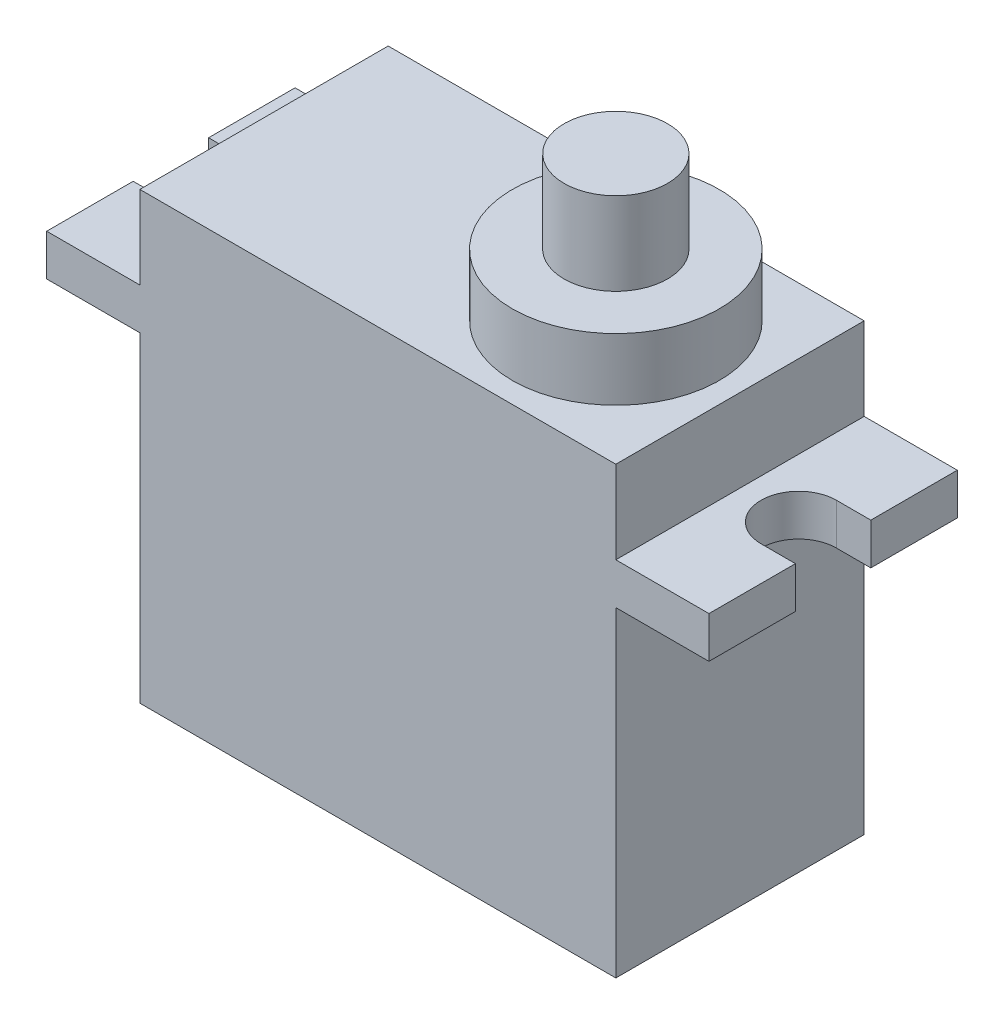
ISO-10303-21;
HEADER;
FILE_DESCRIPTION(('STEP AP214'),'2;1');
FILE_NAME('part.step','',(''),(''),'','','');
FILE_SCHEMA(('AUTOMOTIVE_DESIGN { 1 0 10303 214 1 1 1 1 }'));
ENDSEC;
DATA;
#1=APPLICATION_CONTEXT('core data for automotive mechanical design processes');
#2=APPLICATION_PROTOCOL_DEFINITION('international standard','automotive_design',2000,#1);
#3=PRODUCT_CONTEXT('',#1,'mechanical');
#4=PRODUCT('Part','Part','',(#3));
#5=PRODUCT_RELATED_PRODUCT_CATEGORY('part','',(#4));
#6=PRODUCT_DEFINITION_FORMATION('','',#4);
#7=PRODUCT_DEFINITION_CONTEXT('part definition',#1,'design');
#8=PRODUCT_DEFINITION('design','',#6,#7);
#9=PRODUCT_DEFINITION_SHAPE('','',#8);
#10=(LENGTH_UNIT() NAMED_UNIT(*) SI_UNIT(.MILLI.,.METRE.));
#11=(NAMED_UNIT(*) PLANE_ANGLE_UNIT() SI_UNIT($,.RADIAN.));
#12=(NAMED_UNIT(*) SI_UNIT($,.STERADIAN.) SOLID_ANGLE_UNIT());
#13=UNCERTAINTY_MEASURE_WITH_UNIT(LENGTH_MEASURE(1.E-05),#10,'distance_accuracy_value','');
#14=(GEOMETRIC_REPRESENTATION_CONTEXT(3) GLOBAL_UNCERTAINTY_ASSIGNED_CONTEXT((#13)) GLOBAL_UNIT_ASSIGNED_CONTEXT((#10,
#11,#12)) REPRESENTATION_CONTEXT('',''));
#15=CARTESIAN_POINT('',(0.,0.,0.));
#16=DIRECTION('',(0.,0.,1.));
#17=DIRECTION('',(1.,0.,0.));
#18=AXIS2_PLACEMENT_3D('',#15,#16,#17);
#19=CARTESIAN_POINT('',(-16.,4.75,0.));
#20=DIRECTION('',(-1.,0.,0.));
#21=DIRECTION('',(0.,0.,1.));
#22=AXIS2_PLACEMENT_3D('',#19,#20,#21);
#23=PLANE('',#22);
#24=DIRECTION('',(0.,1.,0.));
#25=VECTOR('',#24,1.);
#26=CARTESIAN_POINT('',(-16.,2.75,4.17873864816859));
#27=LINE('',#26,#25);
#28=CARTESIAN_POINT('',(-16.,4.75,4.17873864816859));
#29=VERTEX_POINT('',#28);
#30=CARTESIAN_POINT('',(-16.,6.75,4.17873864816859));
#31=VERTEX_POINT('',#30);
#32=EDGE_CURVE('E321',#29,#31,#27,.T.);
#33=ORIENTED_EDGE('',*,*,#32,.T.);
#34=DIRECTION('',(0.,0.,1.));
#35=VECTOR('',#34,1.);
#36=CARTESIAN_POINT('',(-16.,6.75,0.));
#37=LINE('',#36,#35);
#38=CARTESIAN_POINT('',(-16.,6.75,0.));
#39=VERTEX_POINT('',#38);
#40=EDGE_CURVE('E237',#39,#31,#37,.T.);
#41=ORIENTED_EDGE('',*,*,#40,.F.);
#42=DIRECTION('',(0.,1.,0.));
#43=VECTOR('',#42,1.);
#44=CARTESIAN_POINT('',(-16.,4.75,0.));
#45=LINE('',#44,#43);
#46=CARTESIAN_POINT('',(-16.,4.75,0.));
#47=VERTEX_POINT('',#46);
#48=EDGE_CURVE('E251',#47,#39,#45,.T.);
#49=ORIENTED_EDGE('',*,*,#48,.F.);
#50=DIRECTION('',(0.,0.,1.));
#51=VECTOR('',#50,1.);
#52=CARTESIAN_POINT('',(-16.,4.75,0.));
#53=LINE('',#52,#51);
#54=EDGE_CURVE('E364',#47,#29,#53,.T.);
#55=ORIENTED_EDGE('',*,*,#54,.T.);
#56=EDGE_LOOP('',(#33,#41,#49,#55));
#57=FACE_BOUND('',#56,.T.);
#58=ADVANCED_FACE('F73',(#57),#23,.T.);
#59=CARTESIAN_POINT('',(16.,4.75,0.));
#60=DIRECTION('',(1.,0.,0.));
#61=DIRECTION('',(0.,0.,-1.));
#62=AXIS2_PLACEMENT_3D('',#59,#60,#61);
#63=PLANE('',#62);
#64=DIRECTION('',(0.,-1.,0.));
#65=VECTOR('',#64,1.);
#66=CARTESIAN_POINT('',(16.,4.75,7.82126135183141));
#67=LINE('',#66,#65);
#68=CARTESIAN_POINT('',(16.,6.75,7.82126135183141));
#69=VERTEX_POINT('',#68);
#70=CARTESIAN_POINT('',(16.,4.75,7.82126135183141));
#71=VERTEX_POINT('',#70);
#72=EDGE_CURVE('E306',#69,#71,#67,.T.);
#73=ORIENTED_EDGE('',*,*,#72,.F.);
#74=DIRECTION('',(0.,0.,-1.));
#75=VECTOR('',#74,1.);
#76=CARTESIAN_POINT('',(16.,6.75,0.));
#77=LINE('',#76,#75);
#78=CARTESIAN_POINT('',(16.,6.75,12.));
#79=VERTEX_POINT('',#78);
#80=EDGE_CURVE('E369',#79,#69,#77,.T.);
#81=ORIENTED_EDGE('',*,*,#80,.F.);
#82=DIRECTION('',(0.,1.,0.));
#83=VECTOR('',#82,1.);
#84=CARTESIAN_POINT('',(16.,4.75,12.));
#85=LINE('',#84,#83);
#86=CARTESIAN_POINT('',(16.,4.75,12.));
#87=VERTEX_POINT('',#86);
#88=EDGE_CURVE('E249',#87,#79,#85,.T.);
#89=ORIENTED_EDGE('',*,*,#88,.F.);
#90=DIRECTION('',(0.,0.,-1.));
#91=VECTOR('',#90,1.);
#92=CARTESIAN_POINT('',(16.,4.75,0.));
#93=LINE('',#92,#91);
#94=EDGE_CURVE('E357',#87,#71,#93,.T.);
#95=ORIENTED_EDGE('',*,*,#94,.T.);
#96=EDGE_LOOP('',(#73,#81,#89,#95));
#97=FACE_BOUND('',#96,.T.);
#98=ADVANCED_FACE('F397',(#97),#63,.T.);
#99=CARTESIAN_POINT('',(11.5,10.75,12.));
#100=DIRECTION('',(-1.,0.,0.));
#101=DIRECTION('',(0.,-1.,0.));
#102=AXIS2_PLACEMENT_3D('',#99,#100,#101);
#103=PLANE('',#102);
#104=DIRECTION('',(0.,0.,-1.));
#105=VECTOR('',#104,1.);
#106=CARTESIAN_POINT('',(11.5,4.75,12.));
#107=LINE('',#106,#105);
#108=CARTESIAN_POINT('',(11.5,4.75,12.));
#109=VERTEX_POINT('',#108);
#110=CARTESIAN_POINT('',(11.5,4.75,0.));
#111=VERTEX_POINT('',#110);
#112=EDGE_CURVE('E270',#109,#111,#107,.T.);
#113=ORIENTED_EDGE('',*,*,#112,.F.);
#114=DIRECTION('',(0.,1.,0.));
#115=VECTOR('',#114,1.);
#116=CARTESIAN_POINT('',(11.5,10.75,12.));
#117=LINE('',#116,#115);
#118=CARTESIAN_POINT('',(11.5,-10.75,12.));
#119=VERTEX_POINT('',#118);
#120=EDGE_CURVE('E269',#119,#109,#117,.T.);
#121=ORIENTED_EDGE('',*,*,#120,.F.);
#122=DIRECTION('',(0.,0.,-1.));
#123=VECTOR('',#122,1.);
#124=CARTESIAN_POINT('',(11.5,-10.75,12.));
#125=LINE('',#124,#123);
#126=CARTESIAN_POINT('',(11.5,-10.75,0.));
#127=VERTEX_POINT('',#126);
#128=EDGE_CURVE('E285',#119,#127,#125,.T.);
#129=ORIENTED_EDGE('',*,*,#128,.T.);
#130=DIRECTION('',(0.,1.,0.));
#131=VECTOR('',#130,1.);
#132=CARTESIAN_POINT('',(11.5,10.75,0.));
#133=LINE('',#132,#131);
#134=EDGE_CURVE('E282',#127,#111,#133,.T.);
#135=ORIENTED_EDGE('',*,*,#134,.T.);
#136=EDGE_LOOP('',(#113,#121,#129,#135));
#137=FACE_BOUND('',#136,.T.);
#138=ADVANCED_FACE('F414',(#137),#103,.F.);
#139=CARTESIAN_POINT('',(-11.5,10.75,12.));
#140=DIRECTION('',(1.,0.,0.));
#141=DIRECTION('',(0.,1.,0.));
#142=AXIS2_PLACEMENT_3D('',#139,#140,#141);
#143=PLANE('',#142);
#144=DIRECTION('',(0.,0.,1.));
#145=VECTOR('',#144,1.);
#146=CARTESIAN_POINT('',(-11.5,4.75,12.));
#147=LINE('',#146,#145);
#148=CARTESIAN_POINT('',(-11.5,4.75,0.));
#149=VERTEX_POINT('',#148);
#150=CARTESIAN_POINT('',(-11.5,4.75,12.));
#151=VERTEX_POINT('',#150);
#152=EDGE_CURVE('E264',#149,#151,#147,.T.);
#153=ORIENTED_EDGE('',*,*,#152,.F.);
#154=DIRECTION('',(0.,-1.,0.));
#155=VECTOR('',#154,1.);
#156=CARTESIAN_POINT('',(-11.5,10.75,0.));
#157=LINE('',#156,#155);
#158=CARTESIAN_POINT('',(-11.5,-10.75,0.));
#159=VERTEX_POINT('',#158);
#160=EDGE_CURVE('E286',#149,#159,#157,.T.);
#161=ORIENTED_EDGE('',*,*,#160,.T.);
#162=DIRECTION('',(0.,0.,-1.));
#163=VECTOR('',#162,1.);
#164=CARTESIAN_POINT('',(-11.5,-10.75,12.));
#165=LINE('',#164,#163);
#166=CARTESIAN_POINT('',(-11.5,-10.75,12.));
#167=VERTEX_POINT('',#166);
#168=EDGE_CURVE('E296',#167,#159,#165,.T.);
#169=ORIENTED_EDGE('',*,*,#168,.F.);
#170=DIRECTION('',(0.,-1.,0.));
#171=VECTOR('',#170,1.);
#172=CARTESIAN_POINT('',(-11.5,10.75,12.));
#173=LINE('',#172,#171);
#174=EDGE_CURVE('E277',#151,#167,#173,.T.);
#175=ORIENTED_EDGE('',*,*,#174,.F.);
#176=EDGE_LOOP('',(#153,#161,#169,#175));
#177=FACE_BOUND('',#176,.T.);
#178=ADVANCED_FACE('F424',(#177),#143,.F.);
#179=CARTESIAN_POINT('',(11.5,6.75,12.));
#180=VERTEX_POINT('',#179);
#181=CARTESIAN_POINT('',(11.5,10.75,12.));
#182=VERTEX_POINT('',#181);
#183=EDGE_CURVE('E273',#180,#182,#117,.T.);
#184=ORIENTED_EDGE('',*,*,#183,.F.);
#185=DIRECTION('',(0.,0.,-1.));
#186=VECTOR('',#185,1.);
#187=CARTESIAN_POINT('',(11.5,6.75,12.));
#188=LINE('',#187,#186);
#189=CARTESIAN_POINT('',(11.5,6.75,0.));
#190=VERTEX_POINT('',#189);
#191=EDGE_CURVE('E265',#180,#190,#188,.T.);
#192=ORIENTED_EDGE('',*,*,#191,.T.);
#193=CARTESIAN_POINT('',(11.5,10.75,0.));
#194=VERTEX_POINT('',#193);
#195=EDGE_CURVE('E267',#190,#194,#133,.T.);
#196=ORIENTED_EDGE('',*,*,#195,.T.);
#197=DIRECTION('',(0.,0.,-1.));
#198=VECTOR('',#197,1.);
#199=CARTESIAN_POINT('',(11.5,10.75,12.));
#200=LINE('',#199,#198);
#201=EDGE_CURVE('E302',#182,#194,#200,.T.);
#202=ORIENTED_EDGE('',*,*,#201,.F.);
#203=EDGE_LOOP('',(#184,#192,#196,#202));
#204=FACE_BOUND('',#203,.T.);
#205=ADVANCED_FACE('F80',(#204),#103,.F.);
#206=CARTESIAN_POINT('',(-11.5,10.75,12.));
#207=DIRECTION('',(0.,-1.,0.));
#208=DIRECTION('',(0.,0.,-1.));
#209=AXIS2_PLACEMENT_3D('',#206,#207,#208);
#210=PLANE('',#209);
#211=CARTESIAN_POINT('',(5.5,10.75,6.));
#212=DIRECTION('',(0.,1.,0.));
#213=DIRECTION('',(0.,0.,1.));
#214=AXIS2_PLACEMENT_3D('',#211,#212,#213);
#215=CIRCLE('',#214,5.);
#216=CARTESIAN_POINT('',(5.5,10.75,11.));
#217=VERTEX_POINT('',#216);
#218=EDGE_CURVE('E305',#217,#217,#215,.T.);
#219=ORIENTED_EDGE('',*,*,#218,.F.);
#220=EDGE_LOOP('',(#219));
#221=FACE_BOUND('',#220,.T.);
#222=DIRECTION('',(-1.,0.,0.));
#223=VECTOR('',#222,1.);
#224=CARTESIAN_POINT('',(-11.5,10.75,0.));
#225=LINE('',#224,#223);
#226=CARTESIAN_POINT('',(-11.5,10.75,0.));
#227=VERTEX_POINT('',#226);
#228=EDGE_CURVE('E288',#194,#227,#225,.T.);
#229=ORIENTED_EDGE('',*,*,#228,.T.);
#230=DIRECTION('',(0.,0.,-1.));
#231=VECTOR('',#230,1.);
#232=CARTESIAN_POINT('',(-11.5,10.75,12.));
#233=LINE('',#232,#231);
#234=CARTESIAN_POINT('',(-11.5,10.75,12.));
#235=VERTEX_POINT('',#234);
#236=EDGE_CURVE('E298',#235,#227,#233,.T.);
#237=ORIENTED_EDGE('',*,*,#236,.F.);
#238=DIRECTION('',(-1.,0.,0.));
#239=VECTOR('',#238,1.);
#240=CARTESIAN_POINT('',(-11.5,10.75,12.));
#241=LINE('',#240,#239);
#242=EDGE_CURVE('E272',#182,#235,#241,.T.);
#243=ORIENTED_EDGE('',*,*,#242,.F.);
#244=ORIENTED_EDGE('',*,*,#201,.T.);
#245=EDGE_LOOP('',(#229,#237,#243,#244));
#246=FACE_BOUND('',#245,.T.);
#247=ADVANCED_FACE('F469',(#221,#246),#210,.F.);
#248=CARTESIAN_POINT('',(-11.5,6.75,0.));
#249=VERTEX_POINT('',#248);
#250=EDGE_CURVE('E289',#227,#249,#157,.T.);
#251=ORIENTED_EDGE('',*,*,#250,.T.);
#252=DIRECTION('',(0.,0.,1.));
#253=VECTOR('',#252,1.);
#254=CARTESIAN_POINT('',(-11.5,6.75,12.));
#255=LINE('',#254,#253);
#256=CARTESIAN_POINT('',(-11.5,6.75,12.));
#257=VERTEX_POINT('',#256);
#258=EDGE_CURVE('E253',#249,#257,#255,.T.);
#259=ORIENTED_EDGE('',*,*,#258,.T.);
#260=EDGE_CURVE('E280',#235,#257,#173,.T.);
#261=ORIENTED_EDGE('',*,*,#260,.F.);
#262=ORIENTED_EDGE('',*,*,#236,.T.);
#263=EDGE_LOOP('',(#251,#259,#261,#262));
#264=FACE_BOUND('',#263,.T.);
#265=ADVANCED_FACE('F429',(#264),#143,.F.);
#266=CARTESIAN_POINT('',(-11.5,-10.75,12.));
#267=DIRECTION('',(0.,1.,0.));
#268=DIRECTION('',(0.,0.,1.));
#269=AXIS2_PLACEMENT_3D('',#266,#267,#268);
#270=PLANE('',#269);
#271=DIRECTION('',(1.,0.,0.));
#272=VECTOR('',#271,1.);
#273=CARTESIAN_POINT('',(-11.5,-10.75,0.));
#274=LINE('',#273,#272);
#275=EDGE_CURVE('E295',#159,#127,#274,.T.);
#276=ORIENTED_EDGE('',*,*,#275,.T.);
#277=ORIENTED_EDGE('',*,*,#128,.F.);
#278=DIRECTION('',(1.,0.,0.));
#279=VECTOR('',#278,1.);
#280=CARTESIAN_POINT('',(-11.5,-10.75,12.));
#281=LINE('',#280,#279);
#282=EDGE_CURVE('E278',#167,#119,#281,.T.);
#283=ORIENTED_EDGE('',*,*,#282,.F.);
#284=ORIENTED_EDGE('',*,*,#168,.T.);
#285=EDGE_LOOP('',(#276,#277,#283,#284));
#286=FACE_BOUND('',#285,.T.);
#287=ADVANCED_FACE('F416',(#286),#270,.F.);
#288=CARTESIAN_POINT('',(0.,0.,12.));
#289=DIRECTION('',(0.,0.,1.));
#290=DIRECTION('',(1.,0.,0.));
#291=AXIS2_PLACEMENT_3D('',#288,#289,#290);
#292=PLANE('',#291);
#293=ORIENTED_EDGE('',*,*,#260,.T.);
#294=DIRECTION('',(1.,0.,0.));
#295=VECTOR('',#294,1.);
#296=CARTESIAN_POINT('',(-16.,6.75,12.));
#297=LINE('',#296,#295);
#298=CARTESIAN_POINT('',(-16.,6.75,12.));
#299=VERTEX_POINT('',#298);
#300=EDGE_CURVE('E244',#299,#257,#297,.T.);
#301=ORIENTED_EDGE('',*,*,#300,.F.);
#302=DIRECTION('',(0.,1.,0.));
#303=VECTOR('',#302,1.);
#304=CARTESIAN_POINT('',(-16.,4.75,12.));
#305=LINE('',#304,#303);
#306=CARTESIAN_POINT('',(-16.,4.75,12.));
#307=VERTEX_POINT('',#306);
#308=EDGE_CURVE('E234',#307,#299,#305,.T.);
#309=ORIENTED_EDGE('',*,*,#308,.F.);
#310=DIRECTION('',(1.,0.,0.));
#311=VECTOR('',#310,1.);
#312=CARTESIAN_POINT('',(-16.,4.75,12.));
#313=LINE('',#312,#311);
#314=EDGE_CURVE('E259',#307,#151,#313,.T.);
#315=ORIENTED_EDGE('',*,*,#314,.T.);
#316=ORIENTED_EDGE('',*,*,#174,.T.);
#317=ORIENTED_EDGE('',*,*,#282,.T.);
#318=ORIENTED_EDGE('',*,*,#120,.T.);
#319=EDGE_CURVE('E370',#109,#87,#313,.T.);
#320=ORIENTED_EDGE('',*,*,#319,.T.);
#321=ORIENTED_EDGE('',*,*,#88,.T.);
#322=EDGE_CURVE('E238',#180,#79,#297,.T.);
#323=ORIENTED_EDGE('',*,*,#322,.F.);
#324=ORIENTED_EDGE('',*,*,#183,.T.);
#325=ORIENTED_EDGE('',*,*,#242,.T.);
#326=EDGE_LOOP('',(#293,#301,#309,#315,#316,#317,#318,#320,#321,#323,#324,#325));
#327=FACE_BOUND('',#326,.T.);
#328=ADVANCED_FACE('F393',(#327),#292,.T.);
#329=CARTESIAN_POINT('',(0.,0.,0.));
#330=DIRECTION('',(0.,0.,1.));
#331=DIRECTION('',(1.,0.,0.));
#332=AXIS2_PLACEMENT_3D('',#329,#330,#331);
#333=PLANE('',#332);
#334=ORIENTED_EDGE('',*,*,#195,.F.);
#335=DIRECTION('',(-1.,0.,0.));
#336=VECTOR('',#335,1.);
#337=CARTESIAN_POINT('',(-16.,6.75,0.));
#338=LINE('',#337,#336);
#339=CARTESIAN_POINT('',(16.,6.75,0.));
#340=VERTEX_POINT('',#339);
#341=EDGE_CURVE('E240',#340,#190,#338,.T.);
#342=ORIENTED_EDGE('',*,*,#341,.F.);
#343=DIRECTION('',(0.,1.,0.));
#344=VECTOR('',#343,1.);
#345=CARTESIAN_POINT('',(16.,4.75,0.));
#346=LINE('',#345,#344);
#347=CARTESIAN_POINT('',(16.,4.75,0.));
#348=VERTEX_POINT('',#347);
#349=EDGE_CURVE('E258',#348,#340,#346,.T.);
#350=ORIENTED_EDGE('',*,*,#349,.F.);
#351=DIRECTION('',(-1.,0.,0.));
#352=VECTOR('',#351,1.);
#353=CARTESIAN_POINT('',(-16.,4.75,0.));
#354=LINE('',#353,#352);
#355=EDGE_CURVE('E363',#348,#111,#354,.T.);
#356=ORIENTED_EDGE('',*,*,#355,.T.);
#357=ORIENTED_EDGE('',*,*,#134,.F.);
#358=ORIENTED_EDGE('',*,*,#275,.F.);
#359=ORIENTED_EDGE('',*,*,#160,.F.);
#360=EDGE_CURVE('E360',#149,#47,#354,.T.);
#361=ORIENTED_EDGE('',*,*,#360,.T.);
#362=ORIENTED_EDGE('',*,*,#48,.T.);
#363=EDGE_CURVE('E241',#249,#39,#338,.T.);
#364=ORIENTED_EDGE('',*,*,#363,.F.);
#365=ORIENTED_EDGE('',*,*,#250,.F.);
#366=ORIENTED_EDGE('',*,*,#228,.F.);
#367=EDGE_LOOP('',(#334,#342,#350,#356,#357,#358,#359,#361,#362,#364,#365,#366));
#368=FACE_BOUND('',#367,.T.);
#369=ADVANCED_FACE('F387',(#368),#333,.F.);
#370=DIRECTION('',(0.,1.,0.));
#371=VECTOR('',#370,1.);
#372=CARTESIAN_POINT('',(-16.,2.75,7.82126135183141));
#373=LINE('',#372,#371);
#374=CARTESIAN_POINT('',(-16.,4.75,7.82126135183141));
#375=VERTEX_POINT('',#374);
#376=CARTESIAN_POINT('',(-16.,6.75,7.82126135183141));
#377=VERTEX_POINT('',#376);
#378=EDGE_CURVE('E211',#375,#377,#373,.T.);
#379=ORIENTED_EDGE('',*,*,#378,.F.);
#380=EDGE_CURVE('E365',#375,#307,#53,.T.);
#381=ORIENTED_EDGE('',*,*,#380,.T.);
#382=ORIENTED_EDGE('',*,*,#308,.T.);
#383=EDGE_CURVE('E226',#377,#299,#37,.T.);
#384=ORIENTED_EDGE('',*,*,#383,.F.);
#385=EDGE_LOOP('',(#379,#381,#382,#384));
#386=FACE_BOUND('',#385,.T.);
#387=ADVANCED_FACE('F235',(#386),#23,.T.);
#388=CARTESIAN_POINT('',(0.,6.75,0.));
#389=DIRECTION('',(0.,1.,0.));
#390=DIRECTION('',(0.,0.,1.));
#391=AXIS2_PLACEMENT_3D('',#388,#389,#390);
#392=PLANE('',#391);
#393=DIRECTION('',(-1.,0.,0.));
#394=VECTOR('',#393,1.);
#395=CARTESIAN_POINT('',(-16.,6.75,4.17873864816859));
#396=LINE('',#395,#394);
#397=CARTESIAN_POINT('',(-14.3375893654815,6.75,4.17873864816859));
#398=VERTEX_POINT('',#397);
#399=EDGE_CURVE('E222',#398,#31,#396,.T.);
#400=ORIENTED_EDGE('',*,*,#399,.F.);
#401=CARTESIAN_POINT('',(-14.3375893654815,6.75,6.));
#402=DIRECTION('',(0.,1.,0.));
#403=DIRECTION('',(0.,0.,1.));
#404=AXIS2_PLACEMENT_3D('',#401,#402,#403);
#405=CIRCLE('',#404,1.82126135183141);
#406=CARTESIAN_POINT('',(-14.3375893654815,6.75,7.82126135183141));
#407=VERTEX_POINT('',#406);
#408=EDGE_CURVE('E228',#407,#398,#405,.T.);
#409=ORIENTED_EDGE('',*,*,#408,.F.);
#410=DIRECTION('',(1.,0.,0.));
#411=VECTOR('',#410,1.);
#412=CARTESIAN_POINT('',(-16.,6.75,7.82126135183141));
#413=LINE('',#412,#411);
#414=EDGE_CURVE('E212',#377,#407,#413,.T.);
#415=ORIENTED_EDGE('',*,*,#414,.F.);
#416=ORIENTED_EDGE('',*,*,#383,.T.);
#417=ORIENTED_EDGE('',*,*,#300,.T.);
#418=ORIENTED_EDGE('',*,*,#258,.F.);
#419=ORIENTED_EDGE('',*,*,#363,.T.);
#420=ORIENTED_EDGE('',*,*,#40,.T.);
#421=EDGE_LOOP('',(#400,#409,#415,#416,#417,#418,#419,#420));
#422=FACE_BOUND('',#421,.T.);
#423=ADVANCED_FACE('F223',(#422),#392,.T.);
#424=CARTESIAN_POINT('',(0.,4.75,0.));
#425=DIRECTION('',(0.,1.,0.));
#426=DIRECTION('',(0.,0.,1.));
#427=AXIS2_PLACEMENT_3D('',#424,#425,#426);
#428=PLANE('',#427);
#429=CARTESIAN_POINT('',(-14.3375893654815,4.75,6.));
#430=DIRECTION('',(0.,1.,0.));
#431=DIRECTION('',(0.,0.,1.));
#432=AXIS2_PLACEMENT_3D('',#429,#430,#431);
#433=CIRCLE('',#432,1.82126135183141);
#434=CARTESIAN_POINT('',(-14.3375893654815,4.75,7.82126135183141));
#435=VERTEX_POINT('',#434);
#436=CARTESIAN_POINT('',(-14.3375893654815,4.75,4.17873864816859));
#437=VERTEX_POINT('',#436);
#438=EDGE_CURVE('E84',#435,#437,#433,.T.);
#439=ORIENTED_EDGE('',*,*,#438,.T.);
#440=DIRECTION('',(-1.,0.,0.));
#441=VECTOR('',#440,1.);
#442=CARTESIAN_POINT('',(0.,4.75,4.17873864816859));
#443=LINE('',#442,#441);
#444=EDGE_CURVE('E12',#437,#29,#443,.T.);
#445=ORIENTED_EDGE('',*,*,#444,.T.);
#446=ORIENTED_EDGE('',*,*,#54,.F.);
#447=ORIENTED_EDGE('',*,*,#360,.F.);
#448=ORIENTED_EDGE('',*,*,#152,.T.);
#449=ORIENTED_EDGE('',*,*,#314,.F.);
#450=ORIENTED_EDGE('',*,*,#380,.F.);
#451=DIRECTION('',(1.,0.,0.));
#452=VECTOR('',#451,1.);
#453=CARTESIAN_POINT('',(0.,4.75,7.82126135183141));
#454=LINE('',#453,#452);
#455=EDGE_CURVE('E220',#375,#435,#454,.T.);
#456=ORIENTED_EDGE('',*,*,#455,.T.);
#457=EDGE_LOOP('',(#439,#445,#446,#447,#448,#449,#450,#456));
#458=FACE_BOUND('',#457,.T.);
#459=ADVANCED_FACE('F311',(#458),#428,.F.);
#460=CARTESIAN_POINT('',(14.3375893654815,4.75,6.));
#461=DIRECTION('',(0.,1.,0.));
#462=DIRECTION('',(0.,0.,1.));
#463=AXIS2_PLACEMENT_3D('',#460,#461,#462);
#464=CIRCLE('',#463,1.82126135183141);
#465=CARTESIAN_POINT('',(14.3375893654815,4.75,4.17873864816859));
#466=VERTEX_POINT('',#465);
#467=CARTESIAN_POINT('',(14.3375893654815,4.75,7.82126135183141));
#468=VERTEX_POINT('',#467);
#469=EDGE_CURVE('E341',#466,#468,#464,.T.);
#470=ORIENTED_EDGE('',*,*,#469,.T.);
#471=DIRECTION('',(1.,0.,0.));
#472=VECTOR('',#471,1.);
#473=CARTESIAN_POINT('',(0.,4.75,7.82126135183141));
#474=LINE('',#473,#472);
#475=EDGE_CURVE('E339',#468,#71,#474,.T.);
#476=ORIENTED_EDGE('',*,*,#475,.T.);
#477=ORIENTED_EDGE('',*,*,#94,.F.);
#478=ORIENTED_EDGE('',*,*,#319,.F.);
#479=ORIENTED_EDGE('',*,*,#112,.T.);
#480=ORIENTED_EDGE('',*,*,#355,.F.);
#481=CARTESIAN_POINT('',(16.,4.75,4.17873864816859));
#482=VERTEX_POINT('',#481);
#483=EDGE_CURVE('E247',#482,#348,#93,.T.);
#484=ORIENTED_EDGE('',*,*,#483,.F.);
#485=DIRECTION('',(-1.,0.,0.));
#486=VECTOR('',#485,1.);
#487=CARTESIAN_POINT('',(0.,4.75,4.17873864816859));
#488=LINE('',#487,#486);
#489=EDGE_CURVE('E98',#482,#466,#488,.T.);
#490=ORIENTED_EDGE('',*,*,#489,.T.);
#491=EDGE_LOOP('',(#470,#476,#477,#478,#479,#480,#484,#490));
#492=FACE_BOUND('',#491,.T.);
#493=ADVANCED_FACE('F403',(#492),#428,.F.);
#494=DIRECTION('',(1.,0.,0.));
#495=VECTOR('',#494,1.);
#496=CARTESIAN_POINT('',(16.,6.75,7.82126135183141));
#497=LINE('',#496,#495);
#498=CARTESIAN_POINT('',(14.3375893654815,6.75,7.82126135183141));
#499=VERTEX_POINT('',#498);
#500=EDGE_CURVE('E329',#499,#69,#497,.T.);
#501=ORIENTED_EDGE('',*,*,#500,.F.);
#502=CARTESIAN_POINT('',(14.3375893654815,6.75,6.));
#503=DIRECTION('',(0.,1.,0.));
#504=DIRECTION('',(0.,0.,-1.));
#505=AXIS2_PLACEMENT_3D('',#502,#503,#504);
#506=CIRCLE('',#505,1.82126135183141);
#507=CARTESIAN_POINT('',(14.3375893654815,6.75,4.17873864816859));
#508=VERTEX_POINT('',#507);
#509=EDGE_CURVE('E331',#508,#499,#506,.T.);
#510=ORIENTED_EDGE('',*,*,#509,.F.);
#511=DIRECTION('',(-1.,0.,0.));
#512=VECTOR('',#511,1.);
#513=CARTESIAN_POINT('',(16.,6.75,4.17873864816859));
#514=LINE('',#513,#512);
#515=CARTESIAN_POINT('',(16.,6.75,4.17873864816859));
#516=VERTEX_POINT('',#515);
#517=EDGE_CURVE('E229',#516,#508,#514,.T.);
#518=ORIENTED_EDGE('',*,*,#517,.F.);
#519=EDGE_CURVE('E353',#516,#340,#77,.T.);
#520=ORIENTED_EDGE('',*,*,#519,.T.);
#521=ORIENTED_EDGE('',*,*,#341,.T.);
#522=ORIENTED_EDGE('',*,*,#191,.F.);
#523=ORIENTED_EDGE('',*,*,#322,.T.);
#524=ORIENTED_EDGE('',*,*,#80,.T.);
#525=EDGE_LOOP('',(#501,#510,#518,#520,#521,#522,#523,#524));
#526=FACE_BOUND('',#525,.T.);
#527=ADVANCED_FACE('F376',(#526),#392,.T.);
#528=DIRECTION('',(0.,1.,0.));
#529=VECTOR('',#528,1.);
#530=CARTESIAN_POINT('',(16.,4.75,4.17873864816859));
#531=LINE('',#530,#529);
#532=EDGE_CURVE('E308',#482,#516,#531,.T.);
#533=ORIENTED_EDGE('',*,*,#532,.F.);
#534=ORIENTED_EDGE('',*,*,#483,.T.);
#535=ORIENTED_EDGE('',*,*,#349,.T.);
#536=ORIENTED_EDGE('',*,*,#519,.F.);
#537=EDGE_LOOP('',(#533,#534,#535,#536));
#538=FACE_BOUND('',#537,.T.);
#539=ADVANCED_FACE('F381',(#538),#63,.T.);
#540=CARTESIAN_POINT('',(5.5,13.75,6.));
#541=DIRECTION('',(0.,-1.,0.));
#542=DIRECTION('',(0.,0.,-1.));
#543=AXIS2_PLACEMENT_3D('',#540,#541,#542);
#544=CYLINDRICAL_SURFACE('',#543,5.);
#545=CARTESIAN_POINT('',(5.5,13.75,6.));
#546=DIRECTION('',(0.,1.,0.));
#547=DIRECTION('',(0.,0.,1.));
#548=AXIS2_PLACEMENT_3D('',#545,#546,#547);
#549=CIRCLE('',#548,5.);
#550=CARTESIAN_POINT('',(5.5,13.75,11.));
#551=VERTEX_POINT('',#550);
#552=EDGE_CURVE('E349',#551,#551,#549,.T.);
#553=ORIENTED_EDGE('',*,*,#552,.F.);
#554=EDGE_LOOP('',(#553));
#555=FACE_BOUND('',#554,.T.);
#556=ORIENTED_EDGE('',*,*,#218,.T.);
#557=EDGE_LOOP('',(#556));
#558=FACE_BOUND('',#557,.T.);
#559=ADVANCED_FACE('F480',(#555,#558),#544,.T.);
#560=CARTESIAN_POINT('',(5.5,13.75,6.));
#561=DIRECTION('',(0.,1.,0.));
#562=DIRECTION('',(0.,0.,1.));
#563=AXIS2_PLACEMENT_3D('',#560,#561,#562);
#564=PLANE('',#563);
#565=CARTESIAN_POINT('',(5.5,13.75,6.));
#566=DIRECTION('',(0.,1.,0.));
#567=DIRECTION('',(0.,0.,1.));
#568=AXIS2_PLACEMENT_3D('',#565,#566,#567);
#569=CIRCLE('',#568,2.5);
#570=CARTESIAN_POINT('',(5.5,13.75,8.5));
#571=VERTEX_POINT('',#570);
#572=EDGE_CURVE('E310',#571,#571,#569,.T.);
#573=ORIENTED_EDGE('',*,*,#572,.F.);
#574=EDGE_LOOP('',(#573));
#575=FACE_BOUND('',#574,.T.);
#576=ORIENTED_EDGE('',*,*,#552,.T.);
#577=EDGE_LOOP('',(#576));
#578=FACE_BOUND('',#577,.T.);
#579=ADVANCED_FACE('F476',(#575,#578),#564,.T.);
#580=CARTESIAN_POINT('',(5.5,17.75,6.));
#581=DIRECTION('',(0.,-1.,0.));
#582=DIRECTION('',(0.,0.,-1.));
#583=AXIS2_PLACEMENT_3D('',#580,#581,#582);
#584=CYLINDRICAL_SURFACE('',#583,2.5);
#585=CARTESIAN_POINT('',(5.5,17.75,6.));
#586=DIRECTION('',(0.,1.,0.));
#587=DIRECTION('',(0.,0.,1.));
#588=AXIS2_PLACEMENT_3D('',#585,#586,#587);
#589=CIRCLE('',#588,2.5);
#590=CARTESIAN_POINT('',(5.5,17.75,8.5));
#591=VERTEX_POINT('',#590);
#592=EDGE_CURVE('E347',#591,#591,#589,.T.);
#593=ORIENTED_EDGE('',*,*,#592,.F.);
#594=EDGE_LOOP('',(#593));
#595=FACE_BOUND('',#594,.T.);
#596=ORIENTED_EDGE('',*,*,#572,.T.);
#597=EDGE_LOOP('',(#596));
#598=FACE_BOUND('',#597,.T.);
#599=ADVANCED_FACE('F482',(#595,#598),#584,.T.);
#600=CARTESIAN_POINT('',(5.5,17.75,6.));
#601=DIRECTION('',(0.,1.,0.));
#602=DIRECTION('',(0.,0.,1.));
#603=AXIS2_PLACEMENT_3D('',#600,#601,#602);
#604=PLANE('',#603);
#605=ORIENTED_EDGE('',*,*,#592,.T.);
#606=EDGE_LOOP('',(#605));
#607=FACE_BOUND('',#606,.T.);
#608=ADVANCED_FACE('F507',(#607),#604,.T.);
#609=CARTESIAN_POINT('',(14.3375893654815,2.75,6.));
#610=DIRECTION('',(0.,1.,0.));
#611=DIRECTION('',(0.,0.,1.));
#612=AXIS2_PLACEMENT_3D('',#609,#610,#611);
#613=CYLINDRICAL_SURFACE('',#612,1.82126135183141);
#614=DIRECTION('',(0.,1.,0.));
#615=VECTOR('',#614,1.);
#616=CARTESIAN_POINT('',(14.3375893654815,2.75,4.17873864816859));
#617=LINE('',#616,#615);
#618=EDGE_CURVE('E327',#466,#508,#617,.T.);
#619=ORIENTED_EDGE('',*,*,#618,.T.);
#620=ORIENTED_EDGE('',*,*,#509,.T.);
#621=DIRECTION('',(0.,1.,0.));
#622=VECTOR('',#621,1.);
#623=CARTESIAN_POINT('',(14.3375893654815,2.75,7.82126135183141));
#624=LINE('',#623,#622);
#625=EDGE_CURVE('E332',#468,#499,#624,.T.);
#626=ORIENTED_EDGE('',*,*,#625,.F.);
#627=ORIENTED_EDGE('',*,*,#469,.F.);
#628=EDGE_LOOP('',(#619,#620,#626,#627));
#629=FACE_BOUND('',#628,.T.);
#630=ADVANCED_FACE('F410',(#629),#613,.F.);
#631=CARTESIAN_POINT('',(16.,2.75,7.82126135183141));
#632=DIRECTION('',(0.,0.,1.));
#633=DIRECTION('',(1.,0.,0.));
#634=AXIS2_PLACEMENT_3D('',#631,#632,#633);
#635=PLANE('',#634);
#636=ORIENTED_EDGE('',*,*,#625,.T.);
#637=ORIENTED_EDGE('',*,*,#500,.T.);
#638=ORIENTED_EDGE('',*,*,#72,.T.);
#639=ORIENTED_EDGE('',*,*,#475,.F.);
#640=EDGE_LOOP('',(#636,#637,#638,#639));
#641=FACE_BOUND('',#640,.T.);
#642=ADVANCED_FACE('F405',(#641),#635,.F.);
#643=CARTESIAN_POINT('',(16.,2.75,4.17873864816859));
#644=DIRECTION('',(0.,0.,-1.));
#645=DIRECTION('',(-1.,0.,0.));
#646=AXIS2_PLACEMENT_3D('',#643,#644,#645);
#647=PLANE('',#646);
#648=ORIENTED_EDGE('',*,*,#532,.T.);
#649=ORIENTED_EDGE('',*,*,#517,.T.);
#650=ORIENTED_EDGE('',*,*,#618,.F.);
#651=ORIENTED_EDGE('',*,*,#489,.F.);
#652=EDGE_LOOP('',(#648,#649,#650,#651));
#653=FACE_BOUND('',#652,.T.);
#654=ADVANCED_FACE('F407',(#653),#647,.F.);
#655=CARTESIAN_POINT('',(-16.,2.75,4.17873864816859));
#656=DIRECTION('',(0.,0.,-1.));
#657=DIRECTION('',(-1.,0.,0.));
#658=AXIS2_PLACEMENT_3D('',#655,#656,#657);
#659=PLANE('',#658);
#660=DIRECTION('',(0.,1.,0.));
#661=VECTOR('',#660,1.);
#662=CARTESIAN_POINT('',(-14.3375893654815,2.75,4.17873864816859));
#663=LINE('',#662,#661);
#664=EDGE_CURVE('E317',#437,#398,#663,.T.);
#665=ORIENTED_EDGE('',*,*,#664,.T.);
#666=ORIENTED_EDGE('',*,*,#399,.T.);
#667=ORIENTED_EDGE('',*,*,#32,.F.);
#668=ORIENTED_EDGE('',*,*,#444,.F.);
#669=EDGE_LOOP('',(#665,#666,#667,#668));
#670=FACE_BOUND('',#669,.T.);
#671=ADVANCED_FACE('F432',(#670),#659,.F.);
#672=CARTESIAN_POINT('',(-14.3375893654815,2.75,6.));
#673=DIRECTION('',(0.,1.,0.));
#674=DIRECTION('',(0.,0.,1.));
#675=AXIS2_PLACEMENT_3D('',#672,#673,#674);
#676=CYLINDRICAL_SURFACE('',#675,1.82126135183141);
#677=DIRECTION('',(0.,1.,0.));
#678=VECTOR('',#677,1.);
#679=CARTESIAN_POINT('',(-14.3375893654815,2.75,7.82126135183141));
#680=LINE('',#679,#678);
#681=EDGE_CURVE('E89',#435,#407,#680,.T.);
#682=ORIENTED_EDGE('',*,*,#681,.T.);
#683=ORIENTED_EDGE('',*,*,#408,.T.);
#684=ORIENTED_EDGE('',*,*,#664,.F.);
#685=ORIENTED_EDGE('',*,*,#438,.F.);
#686=EDGE_LOOP('',(#682,#683,#684,#685));
#687=FACE_BOUND('',#686,.T.);
#688=ADVANCED_FACE('F318',(#687),#676,.F.);
#689=CARTESIAN_POINT('',(-16.,2.75,7.82126135183141));
#690=DIRECTION('',(0.,0.,1.));
#691=DIRECTION('',(1.,0.,0.));
#692=AXIS2_PLACEMENT_3D('',#689,#690,#691);
#693=PLANE('',#692);
#694=ORIENTED_EDGE('',*,*,#378,.T.);
#695=ORIENTED_EDGE('',*,*,#414,.T.);
#696=ORIENTED_EDGE('',*,*,#681,.F.);
#697=ORIENTED_EDGE('',*,*,#455,.F.);
#698=EDGE_LOOP('',(#694,#695,#696,#697));
#699=FACE_BOUND('',#698,.T.);
#700=ADVANCED_FACE('F213',(#699),#693,.F.);
#701=CLOSED_SHELL('',(#58,#98,#138,#178,#205,#247,#265,#287,#328,#369,#387,#423,#459,#493,#527,
#539,#559,#579,#599,#608,#630,#642,#654,#671,#688,#700));
#702=MANIFOLD_SOLID_BREP('B2',#701);
#703=ADVANCED_BREP_SHAPE_REPRESENTATION('',(#18,#702),#14);
#704=SHAPE_DEFINITION_REPRESENTATION(#9,#703);
ENDSEC;
END-ISO-10303-21;
